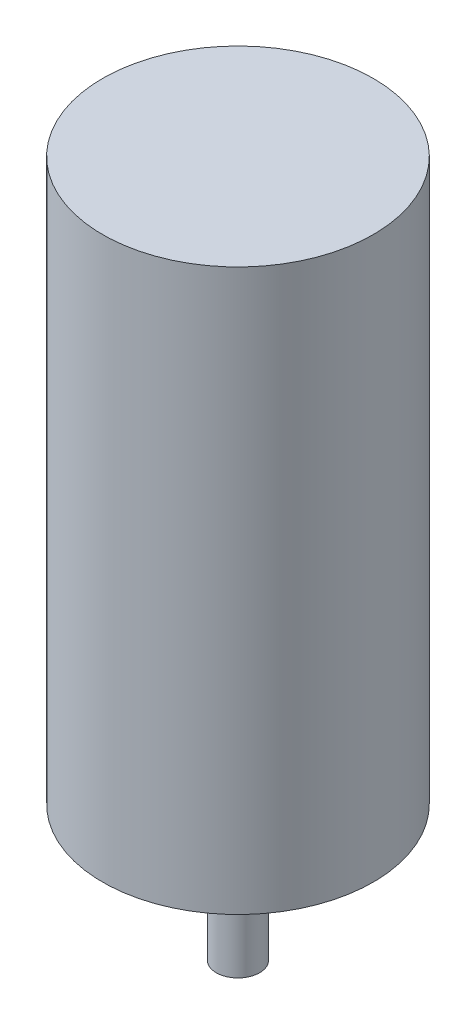
ISO-10303-21;
HEADER;
FILE_DESCRIPTION(('STEP AP214'),'2;1');
FILE_NAME('part.step','',(''),(''),'','','');
FILE_SCHEMA(('AUTOMOTIVE_DESIGN { 1 0 10303 214 1 1 1 1 }'));
ENDSEC;
DATA;
#1=APPLICATION_CONTEXT('core data for automotive mechanical design processes');
#2=APPLICATION_PROTOCOL_DEFINITION('international standard','automotive_design',2000,#1);
#3=PRODUCT_CONTEXT('',#1,'mechanical');
#4=PRODUCT('Part','Part','',(#3));
#5=PRODUCT_RELATED_PRODUCT_CATEGORY('part','',(#4));
#6=PRODUCT_DEFINITION_FORMATION('','',#4);
#7=PRODUCT_DEFINITION_CONTEXT('part definition',#1,'design');
#8=PRODUCT_DEFINITION('design','',#6,#7);
#9=PRODUCT_DEFINITION_SHAPE('','',#8);
#10=(LENGTH_UNIT() NAMED_UNIT(*) SI_UNIT(.MILLI.,.METRE.));
#11=(NAMED_UNIT(*) PLANE_ANGLE_UNIT() SI_UNIT($,.RADIAN.));
#12=(NAMED_UNIT(*) SI_UNIT($,.STERADIAN.) SOLID_ANGLE_UNIT());
#13=UNCERTAINTY_MEASURE_WITH_UNIT(LENGTH_MEASURE(1.E-05),#10,'distance_accuracy_value','');
#14=(GEOMETRIC_REPRESENTATION_CONTEXT(3) GLOBAL_UNCERTAINTY_ASSIGNED_CONTEXT((#13)) GLOBAL_UNIT_ASSIGNED_CONTEXT((#10,
#11,#12)) REPRESENTATION_CONTEXT('',''));
#15=CARTESIAN_POINT('',(0.,0.,0.));
#16=DIRECTION('',(0.,0.,1.));
#17=DIRECTION('',(1.,0.,0.));
#18=AXIS2_PLACEMENT_3D('',#15,#16,#17);
#19=CARTESIAN_POINT('',(0.,-2.5,0.));
#20=DIRECTION('',(0.,-1.,0.));
#21=DIRECTION('',(0.,0.,-1.));
#22=AXIS2_PLACEMENT_3D('',#19,#20,#21);
#23=PLANE('',#22);
#24=CARTESIAN_POINT('',(0.,-2.5,0.));
#25=DIRECTION('',(0.,-1.,0.));
#26=DIRECTION('',(0.,0.,-1.));
#27=AXIS2_PLACEMENT_3D('',#24,#25,#26);
#28=CIRCLE('',#27,3.5);
#29=CARTESIAN_POINT('',(0.,-2.5,-3.5));
#30=VERTEX_POINT('',#29);
#31=EDGE_CURVE('E49',#30,#30,#28,.T.);
#32=ORIENTED_EDGE('',*,*,#31,.T.);
#33=EDGE_LOOP('',(#32));
#34=FACE_BOUND('',#33,.T.);
#35=CARTESIAN_POINT('',(0.,-2.5,0.));
#36=DIRECTION('',(0.,-1.,0.));
#37=DIRECTION('',(0.,0.,-1.));
#38=AXIS2_PLACEMENT_3D('',#35,#36,#37);
#39=CIRCLE('',#38,2.);
#40=CARTESIAN_POINT('',(0.,-2.5,-2.));
#41=VERTEX_POINT('',#40);
#42=EDGE_CURVE('E54',#41,#41,#39,.T.);
#43=ORIENTED_EDGE('',*,*,#42,.F.);
#44=EDGE_LOOP('',(#43));
#45=FACE_BOUND('',#44,.T.);
#46=ADVANCED_FACE('F33',(#34,#45),#23,.T.);
#47=CARTESIAN_POINT('',(0.,0.,0.));
#48=DIRECTION('',(0.,1.,0.));
#49=DIRECTION('',(0.,0.,1.));
#50=AXIS2_PLACEMENT_3D('',#47,#48,#49);
#51=PLANE('',#50);
#52=CARTESIAN_POINT('',(8.5,0.,0.));
#53=DIRECTION('',(0.,-1.,0.));
#54=DIRECTION('',(0.,0.,-1.));
#55=AXIS2_PLACEMENT_3D('',#52,#53,#54);
#56=CIRCLE('',#55,1.65);
#57=CARTESIAN_POINT('',(8.5,0.,-1.65));
#58=VERTEX_POINT('',#57);
#59=EDGE_CURVE('E66',#58,#58,#56,.T.);
#60=ORIENTED_EDGE('',*,*,#59,.F.);
#61=EDGE_LOOP('',(#60));
#62=FACE_BOUND('',#61,.T.);
#63=CARTESIAN_POINT('',(-8.5,0.,0.));
#64=DIRECTION('',(0.,-1.,0.));
#65=DIRECTION('',(0.,0.,-1.));
#66=AXIS2_PLACEMENT_3D('',#63,#64,#65);
#67=CIRCLE('',#66,1.65);
#68=CARTESIAN_POINT('',(-8.5,0.,-1.65));
#69=VERTEX_POINT('',#68);
#70=EDGE_CURVE('E60',#69,#69,#67,.T.);
#71=ORIENTED_EDGE('',*,*,#70,.F.);
#72=EDGE_LOOP('',(#71));
#73=FACE_BOUND('',#72,.T.);
#74=CARTESIAN_POINT('',(0.,0.,0.));
#75=DIRECTION('',(0.,1.,0.));
#76=DIRECTION('',(0.,0.,1.));
#77=AXIS2_PLACEMENT_3D('',#74,#75,#76);
#78=CIRCLE('',#77,12.5);
#79=CARTESIAN_POINT('',(0.,0.,-12.5));
#80=VERTEX_POINT('',#79);
#81=EDGE_CURVE('E44',#80,#80,#78,.T.);
#82=ORIENTED_EDGE('',*,*,#81,.F.);
#83=EDGE_LOOP('',(#82));
#84=FACE_BOUND('',#83,.T.);
#85=CARTESIAN_POINT('',(0.,0.,0.));
#86=DIRECTION('',(0.,1.,0.));
#87=DIRECTION('',(0.,0.,1.));
#88=AXIS2_PLACEMENT_3D('',#85,#86,#87);
#89=CIRCLE('',#88,3.5);
#90=CARTESIAN_POINT('',(0.,0.,3.5));
#91=VERTEX_POINT('',#90);
#92=EDGE_CURVE('E10',#91,#91,#89,.F.);
#93=ORIENTED_EDGE('',*,*,#92,.F.);
#94=EDGE_LOOP('',(#93));
#95=FACE_BOUND('',#94,.T.);
#96=ADVANCED_FACE('F81',(#62,#73,#84,#95),#51,.F.);
#97=CARTESIAN_POINT('',(0.,51.8,0.));
#98=DIRECTION('',(0.,-1.,0.));
#99=DIRECTION('',(0.,0.,-1.));
#100=AXIS2_PLACEMENT_3D('',#97,#98,#99);
#101=CYLINDRICAL_SURFACE('',#100,12.5);
#102=CARTESIAN_POINT('',(0.,51.8,0.));
#103=DIRECTION('',(0.,1.,0.));
#104=DIRECTION('',(0.,0.,1.));
#105=AXIS2_PLACEMENT_3D('',#102,#103,#104);
#106=CIRCLE('',#105,12.5);
#107=CARTESIAN_POINT('',(0.,51.8,-12.5));
#108=VERTEX_POINT('',#107);
#109=EDGE_CURVE('E40',#108,#108,#106,.T.);
#110=CARTESIAN_POINT('',(0.,51.8,-12.5));
#111=CARTESIAN_POINT('',(0.,51.2604166666667,-12.5));
#112=CARTESIAN_POINT('',(0.,50.7208333333333,-12.5));
#113=CARTESIAN_POINT('',(0.,49.6416666666667,-12.5));
#114=CARTESIAN_POINT('',(0.,49.1020833333333,-12.5));
#115=CARTESIAN_POINT('',(0.,48.0229166666667,-12.5));
#116=CARTESIAN_POINT('',(0.,47.4833333333333,-12.5));
#117=CARTESIAN_POINT('',(0.,46.4041666666667,-12.5));
#118=CARTESIAN_POINT('',(0.,45.8645833333333,-12.5));
#119=CARTESIAN_POINT('',(0.,44.7854166666667,-12.5));
#120=CARTESIAN_POINT('',(0.,44.2458333333333,-12.5));
#121=CARTESIAN_POINT('',(0.,43.1666666666667,-12.5));
#122=CARTESIAN_POINT('',(0.,42.6270833333333,-12.5));
#123=CARTESIAN_POINT('',(0.,41.5479166666667,-12.5));
#124=CARTESIAN_POINT('',(0.,41.0083333333333,-12.5));
#125=CARTESIAN_POINT('',(0.,39.9291666666667,-12.5));
#126=CARTESIAN_POINT('',(0.,39.3895833333333,-12.5));
#127=CARTESIAN_POINT('',(0.,38.3104166666667,-12.5));
#128=CARTESIAN_POINT('',(0.,37.7708333333333,-12.5));
#129=CARTESIAN_POINT('',(0.,36.6916666666667,-12.5));
#130=CARTESIAN_POINT('',(0.,36.1520833333333,-12.5));
#131=CARTESIAN_POINT('',(0.,35.0729166666667,-12.5));
#132=CARTESIAN_POINT('',(0.,34.5333333333333,-12.5));
#133=CARTESIAN_POINT('',(0.,33.4541666666667,-12.5));
#134=CARTESIAN_POINT('',(0.,32.9145833333333,-12.5));
#135=CARTESIAN_POINT('',(0.,31.8354166666667,-12.5));
#136=CARTESIAN_POINT('',(0.,31.2958333333333,-12.5));
#137=CARTESIAN_POINT('',(0.,30.2166666666667,-12.5));
#138=CARTESIAN_POINT('',(0.,29.6770833333333,-12.5));
#139=CARTESIAN_POINT('',(0.,28.5979166666667,-12.5));
#140=CARTESIAN_POINT('',(0.,28.0583333333333,-12.5));
#141=CARTESIAN_POINT('',(0.,26.9791666666667,-12.5));
#142=CARTESIAN_POINT('',(0.,26.4395833333333,-12.5));
#143=CARTESIAN_POINT('',(0.,25.3604166666667,-12.5));
#144=CARTESIAN_POINT('',(0.,24.8208333333333,-12.5));
#145=CARTESIAN_POINT('',(0.,23.7416666666667,-12.5));
#146=CARTESIAN_POINT('',(0.,23.2020833333333,-12.5));
#147=CARTESIAN_POINT('',(0.,22.1229166666667,-12.5));
#148=CARTESIAN_POINT('',(0.,21.5833333333333,-12.5));
#149=CARTESIAN_POINT('',(0.,20.5041666666667,-12.5));
#150=CARTESIAN_POINT('',(0.,19.9645833333333,-12.5));
#151=CARTESIAN_POINT('',(0.,18.8854166666667,-12.5));
#152=CARTESIAN_POINT('',(0.,18.3458333333333,-12.5));
#153=CARTESIAN_POINT('',(0.,17.2666666666667,-12.5));
#154=CARTESIAN_POINT('',(0.,16.7270833333333,-12.5));
#155=CARTESIAN_POINT('',(0.,15.6479166666667,-12.5));
#156=CARTESIAN_POINT('',(0.,15.1083333333333,-12.5));
#157=CARTESIAN_POINT('',(0.,14.0291666666667,-12.5));
#158=CARTESIAN_POINT('',(0.,13.4895833333333,-12.5));
#159=CARTESIAN_POINT('',(0.,12.4104166666667,-12.5));
#160=CARTESIAN_POINT('',(0.,11.8708333333333,-12.5));
#161=CARTESIAN_POINT('',(0.,10.7916666666667,-12.5));
#162=CARTESIAN_POINT('',(0.,10.2520833333333,-12.5));
#163=CARTESIAN_POINT('',(0.,9.17291666666666,-12.5));
#164=CARTESIAN_POINT('',(0.,8.63333333333333,-12.5));
#165=CARTESIAN_POINT('',(0.,7.55416666666666,-12.5));
#166=CARTESIAN_POINT('',(0.,7.01458333333333,-12.5));
#167=CARTESIAN_POINT('',(0.,5.93541666666666,-12.5));
#168=CARTESIAN_POINT('',(0.,5.39583333333333,-12.5));
#169=CARTESIAN_POINT('',(0.,4.31666666666666,-12.5));
#170=CARTESIAN_POINT('',(0.,3.77708333333332,-12.5));
#171=CARTESIAN_POINT('',(0.,2.69791666666666,-12.5));
#172=CARTESIAN_POINT('',(0.,2.15833333333333,-12.5));
#173=CARTESIAN_POINT('',(0.,1.07916666666666,-12.5));
#174=CARTESIAN_POINT('',(0.,0.539583333333327,-12.5));
#175=CARTESIAN_POINT('',(0.,0.,-12.5));
#176=B_SPLINE_CURVE_WITH_KNOTS('',3,(#110,#111,#112,#113,#114,#115,#116,#117,#118,#119,#120,
#121,#122,#123,#124,#125,#126,#127,#128,#129,#130,#131,#132,#133,#134,#135,#136,#137,#138,#139,
#140,#141,#142,#143,#144,#145,#146,#147,#148,#149,#150,#151,#152,#153,#154,#155,#156,#157,#158,
#159,#160,#161,#162,#163,#164,#165,#166,#167,#168,#169,#170,#171,#172,#173,#174,#175),
.UNSPECIFIED.,.F.,.F.,(4,2,2,2,2,2,2,2,2,2,2,2,2,2,2,2,2,2,2,2,2,2,2,2,2,2,2,2,2,2,2,2,4),(0.,
1.61875,3.2375,4.85625,6.47499999999999,8.09375,9.71249999999999,11.33125,12.95,14.56875,
16.1875,17.80625,19.425,21.04375,22.6625,24.28125,25.9,27.51875,29.1375,30.75625,32.375,
33.99375,35.6125,37.23125,38.85,40.46875,42.0875,43.70625,45.325,46.94375,48.5625,50.18125,
51.8),.UNSPECIFIED.);
#177=EDGE_CURVE('BSEAM35',#108,#80,#176,.T.);
#178=ORIENTED_EDGE('',*,*,#109,.F.);
#179=ORIENTED_EDGE('',*,*,#81,.T.);
#180=ORIENTED_EDGE('',*,*,#177,.T.);
#181=ORIENTED_EDGE('',*,*,#177,.F.);
#182=EDGE_LOOP('',(#178,#180,#179,#181));
#183=FACE_BOUND('',#182,.T.);
#184=ADVANCED_FACE('F35',(#183),#101,.T.);
#185=CARTESIAN_POINT('',(0.,51.8,0.));
#186=DIRECTION('',(0.,1.,0.));
#187=DIRECTION('',(0.,0.,1.));
#188=AXIS2_PLACEMENT_3D('',#185,#186,#187);
#189=PLANE('',#188);
#190=ORIENTED_EDGE('',*,*,#109,.T.);
#191=EDGE_LOOP('',(#190));
#192=FACE_BOUND('',#191,.T.);
#193=ADVANCED_FACE('F90',(#192),#189,.T.);
#194=CARTESIAN_POINT('',(0.,-2.5,0.));
#195=DIRECTION('',(0.,1.,0.));
#196=DIRECTION('',(0.,0.,1.));
#197=AXIS2_PLACEMENT_3D('',#194,#195,#196);
#198=CYLINDRICAL_SURFACE('',#197,3.5);
#199=ORIENTED_EDGE('',*,*,#31,.F.);
#200=EDGE_LOOP('',(#199));
#201=FACE_BOUND('',#200,.T.);
#202=ORIENTED_EDGE('',*,*,#92,.T.);
#203=EDGE_LOOP('',(#202));
#204=FACE_BOUND('',#203,.T.);
#205=ADVANCED_FACE('F95',(#201,#204),#198,.T.);
#206=CARTESIAN_POINT('',(0.,-12.5,0.));
#207=DIRECTION('',(0.,1.,0.));
#208=DIRECTION('',(0.,0.,1.));
#209=AXIS2_PLACEMENT_3D('',#206,#207,#208);
#210=CYLINDRICAL_SURFACE('',#209,2.);
#211=CARTESIAN_POINT('',(0.,-12.5,0.));
#212=DIRECTION('',(0.,-1.,0.));
#213=DIRECTION('',(0.,0.,-1.));
#214=AXIS2_PLACEMENT_3D('',#211,#212,#213);
#215=CIRCLE('',#214,2.);
#216=CARTESIAN_POINT('',(0.,-12.5,-2.));
#217=VERTEX_POINT('',#216);
#218=EDGE_CURVE('E53',#217,#217,#215,.T.);
#219=ORIENTED_EDGE('',*,*,#218,.F.);
#220=EDGE_LOOP('',(#219));
#221=FACE_BOUND('',#220,.T.);
#222=ORIENTED_EDGE('',*,*,#42,.T.);
#223=EDGE_LOOP('',(#222));
#224=FACE_BOUND('',#223,.T.);
#225=ADVANCED_FACE('F105',(#221,#224),#210,.T.);
#226=CARTESIAN_POINT('',(0.,-12.5,0.));
#227=DIRECTION('',(0.,-1.,0.));
#228=DIRECTION('',(0.,0.,-1.));
#229=AXIS2_PLACEMENT_3D('',#226,#227,#228);
#230=PLANE('',#229);
#231=ORIENTED_EDGE('',*,*,#218,.T.);
#232=EDGE_LOOP('',(#231));
#233=FACE_BOUND('',#232,.T.);
#234=ADVANCED_FACE('F112',(#233),#230,.T.);
#235=CARTESIAN_POINT('',(-8.5,5.,0.));
#236=DIRECTION('',(0.,-1.,0.));
#237=DIRECTION('',(0.,0.,-1.));
#238=AXIS2_PLACEMENT_3D('',#235,#236,#237);
#239=CYLINDRICAL_SURFACE('',#238,1.65);
#240=CARTESIAN_POINT('',(-8.5,5.,0.));
#241=DIRECTION('',(0.,-1.,0.));
#242=DIRECTION('',(0.,0.,-1.));
#243=AXIS2_PLACEMENT_3D('',#240,#241,#242);
#244=CIRCLE('',#243,1.65);
#245=CARTESIAN_POINT('',(-8.5,5.,-1.65));
#246=VERTEX_POINT('',#245);
#247=EDGE_CURVE('E57',#246,#246,#244,.T.);
#248=ORIENTED_EDGE('',*,*,#247,.F.);
#249=EDGE_LOOP('',(#248));
#250=FACE_BOUND('',#249,.T.);
#251=ORIENTED_EDGE('',*,*,#70,.T.);
#252=EDGE_LOOP('',(#251));
#253=FACE_BOUND('',#252,.T.);
#254=ADVANCED_FACE('F118',(#250,#253),#239,.F.);
#255=CARTESIAN_POINT('',(-8.5,5.,0.));
#256=DIRECTION('',(0.,-1.,0.));
#257=DIRECTION('',(0.,0.,-1.));
#258=AXIS2_PLACEMENT_3D('',#255,#256,#257);
#259=PLANE('',#258);
#260=ORIENTED_EDGE('',*,*,#247,.T.);
#261=EDGE_LOOP('',(#260));
#262=FACE_BOUND('',#261,.T.);
#263=ADVANCED_FACE('F77',(#262),#259,.T.);
#264=CARTESIAN_POINT('',(8.5,5.,0.));
#265=DIRECTION('',(0.,-1.,0.));
#266=DIRECTION('',(0.,0.,-1.));
#267=AXIS2_PLACEMENT_3D('',#264,#265,#266);
#268=CYLINDRICAL_SURFACE('',#267,1.65);
#269=CARTESIAN_POINT('',(8.5,5.,0.));
#270=DIRECTION('',(0.,-1.,0.));
#271=DIRECTION('',(0.,0.,-1.));
#272=AXIS2_PLACEMENT_3D('',#269,#270,#271);
#273=CIRCLE('',#272,1.65);
#274=CARTESIAN_POINT('',(8.5,5.,-1.65));
#275=VERTEX_POINT('',#274);
#276=EDGE_CURVE('E63',#275,#275,#273,.T.);
#277=ORIENTED_EDGE('',*,*,#276,.F.);
#278=EDGE_LOOP('',(#277));
#279=FACE_BOUND('',#278,.T.);
#280=ORIENTED_EDGE('',*,*,#59,.T.);
#281=EDGE_LOOP('',(#280));
#282=FACE_BOUND('',#281,.T.);
#283=ADVANCED_FACE('F74',(#279,#282),#268,.F.);
#284=CARTESIAN_POINT('',(8.5,5.,0.));
#285=DIRECTION('',(0.,-1.,0.));
#286=DIRECTION('',(0.,0.,-1.));
#287=AXIS2_PLACEMENT_3D('',#284,#285,#286);
#288=PLANE('',#287);
#289=ORIENTED_EDGE('',*,*,#276,.T.);
#290=EDGE_LOOP('',(#289));
#291=FACE_BOUND('',#290,.T.);
#292=ADVANCED_FACE('F72',(#291),#288,.T.);
#293=CLOSED_SHELL('',(#46,#96,#184,#193,#205,#225,#234,#254,#263,#283,#292));
#294=MANIFOLD_SOLID_BREP('B2',#293);
#295=ADVANCED_BREP_SHAPE_REPRESENTATION('',(#18,#294),#14);
#296=SHAPE_DEFINITION_REPRESENTATION(#9,#295);
ENDSEC;
END-ISO-10303-21;
